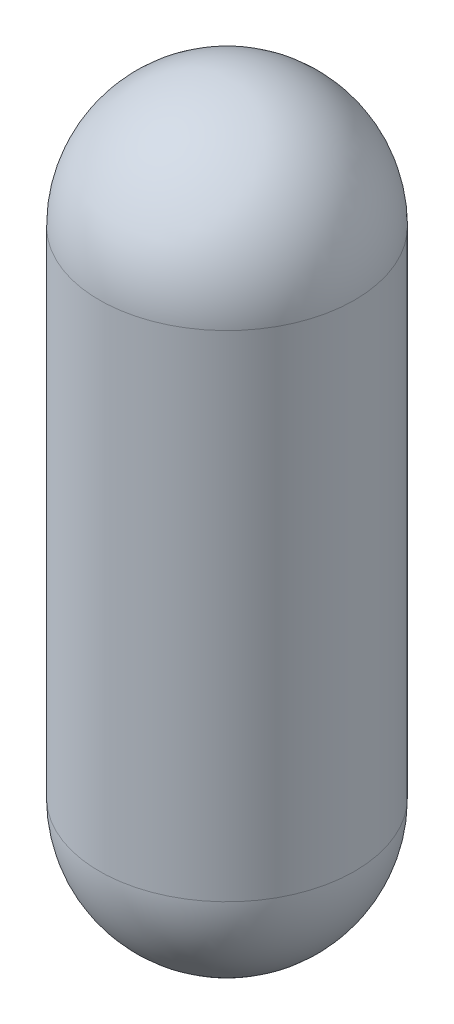
ISO-10303-21;
HEADER;
FILE_DESCRIPTION(('STEP AP214'),'2;1');
FILE_NAME('part.step','',(''),(''),'','','');
FILE_SCHEMA(('AUTOMOTIVE_DESIGN { 1 0 10303 214 1 1 1 1 }'));
ENDSEC;
DATA;
#1=APPLICATION_CONTEXT('core data for automotive mechanical design processes');
#2=APPLICATION_PROTOCOL_DEFINITION('international standard','automotive_design',2000,#1);
#3=PRODUCT_CONTEXT('',#1,'mechanical');
#4=PRODUCT('Part','Part','',(#3));
#5=PRODUCT_RELATED_PRODUCT_CATEGORY('part','',(#4));
#6=PRODUCT_DEFINITION_FORMATION('','',#4);
#7=PRODUCT_DEFINITION_CONTEXT('part definition',#1,'design');
#8=PRODUCT_DEFINITION('design','',#6,#7);
#9=PRODUCT_DEFINITION_SHAPE('','',#8);
#10=(LENGTH_UNIT() NAMED_UNIT(*) SI_UNIT(.MILLI.,.METRE.));
#11=(NAMED_UNIT(*) PLANE_ANGLE_UNIT() SI_UNIT($,.RADIAN.));
#12=(NAMED_UNIT(*) SI_UNIT($,.STERADIAN.) SOLID_ANGLE_UNIT());
#13=UNCERTAINTY_MEASURE_WITH_UNIT(LENGTH_MEASURE(1.E-05),#10,'distance_accuracy_value','');
#14=(GEOMETRIC_REPRESENTATION_CONTEXT(3) GLOBAL_UNCERTAINTY_ASSIGNED_CONTEXT((#13)) GLOBAL_UNIT_ASSIGNED_CONTEXT((#10,
#11,#12)) REPRESENTATION_CONTEXT('',''));
#15=CARTESIAN_POINT('',(0.,0.,0.));
#16=DIRECTION('',(0.,0.,1.));
#17=DIRECTION('',(1.,0.,0.));
#18=AXIS2_PLACEMENT_3D('',#15,#16,#17);
#19=CARTESIAN_POINT('',(0.,317.5,0.));
#20=DIRECTION('',(0.,1.,0.));
#21=DIRECTION('',(1.,0.,0.));
#22=AXIS2_PLACEMENT_3D('',#19,#20,#21);
#23=SPHERICAL_SURFACE('',#22,163.83);
#24=CARTESIAN_POINT('',(0.,317.5,0.));
#25=DIRECTION('',(0.,1.,0.));
#26=DIRECTION('',(-1.,0.,0.));
#27=AXIS2_PLACEMENT_3D('',#24,#25,#26);
#28=CIRCLE('',#27,163.83);
#29=CARTESIAN_POINT('',(-163.83,317.5,0.));
#30=VERTEX_POINT('',#29);
#31=EDGE_CURVE('E10',#30,#30,#28,.T.);
#32=ORIENTED_EDGE('',*,*,#31,.T.);
#33=EDGE_LOOP('',(#32));
#34=FACE_BOUND('',#33,.T.);
#35=ADVANCED_FACE('F34',(#34),#23,.T.);
#36=CARTESIAN_POINT('',(0.,481.33,0.));
#37=DIRECTION('',(0.,1.,0.));
#38=DIRECTION('',(-1.,0.,0.));
#39=AXIS2_PLACEMENT_3D('',#36,#37,#38);
#40=CYLINDRICAL_SURFACE('',#39,163.83);
#41=CARTESIAN_POINT('',(1.4572000950364E-13,-317.5,0.));
#42=DIRECTION('',(0.,1.,0.));
#43=DIRECTION('',(-1.,0.,0.));
#44=AXIS2_PLACEMENT_3D('',#41,#42,#43);
#45=CIRCLE('',#44,163.83);
#46=CARTESIAN_POINT('',(-163.83,-317.5,0.));
#47=VERTEX_POINT('',#46);
#48=EDGE_CURVE('E40',#47,#47,#45,.T.);
#49=ORIENTED_EDGE('',*,*,#48,.T.);
#50=EDGE_LOOP('',(#49));
#51=FACE_BOUND('',#50,.T.);
#52=ORIENTED_EDGE('',*,*,#31,.F.);
#53=EDGE_LOOP('',(#52));
#54=FACE_BOUND('',#53,.T.);
#55=ADVANCED_FACE('F46',(#51,#54),#40,.T.);
#56=CARTESIAN_POINT('',(0.,-317.5,0.));
#57=DIRECTION('',(0.,1.,0.));
#58=DIRECTION('',(-1.,0.,0.));
#59=AXIS2_PLACEMENT_3D('',#56,#57,#58);
#60=SPHERICAL_SURFACE('',#59,163.83);
#61=ORIENTED_EDGE('',*,*,#48,.F.);
#62=EDGE_LOOP('',(#61));
#63=FACE_BOUND('',#62,.T.);
#64=ADVANCED_FACE('F49',(#63),#60,.T.);
#65=CLOSED_SHELL('',(#35,#55,#64));
#66=MANIFOLD_SOLID_BREP('B2',#65);
#67=ADVANCED_BREP_SHAPE_REPRESENTATION('',(#18,#66),#14);
#68=SHAPE_DEFINITION_REPRESENTATION(#9,#67);
ENDSEC;
END-ISO-10303-21;
